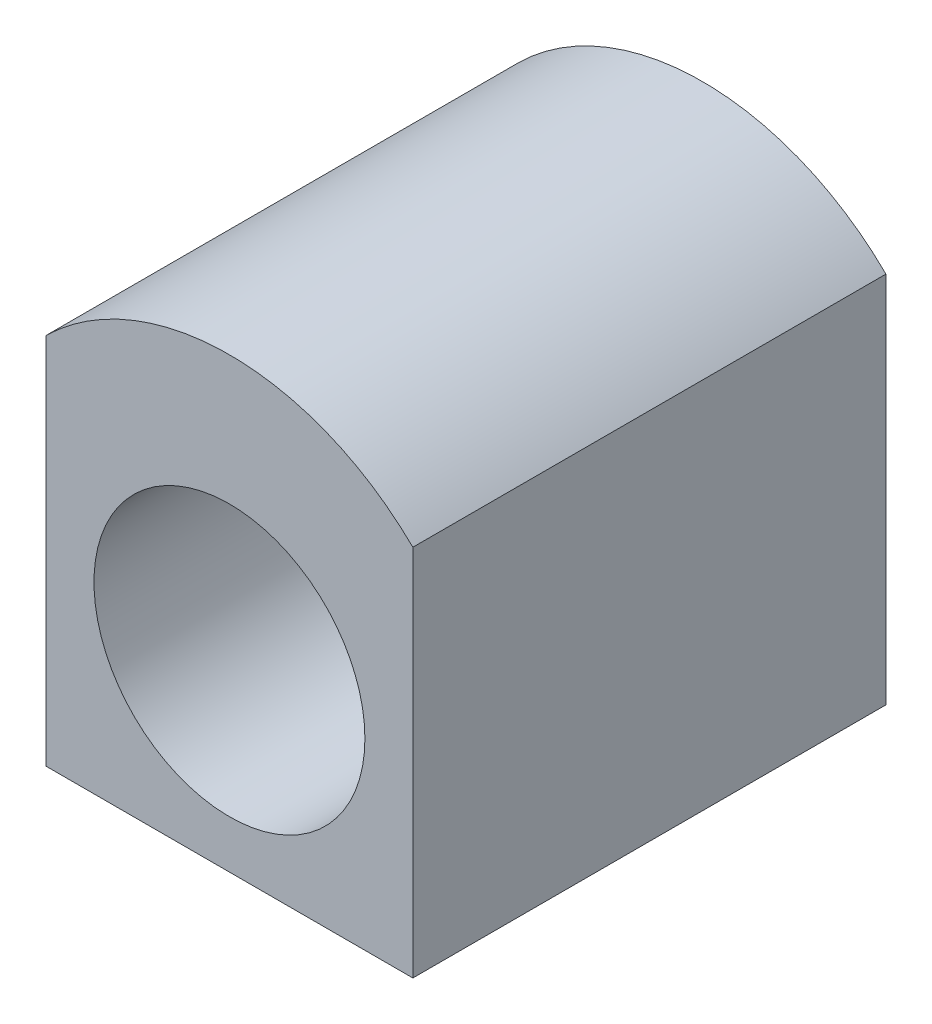
ISO-10303-21;
HEADER;
FILE_DESCRIPTION(('STEP AP214'),'2;1');
FILE_NAME('part.step','',(''),(''),'','','');
FILE_SCHEMA(('AUTOMOTIVE_DESIGN { 1 0 10303 214 1 1 1 1 }'));
ENDSEC;
DATA;
#1=APPLICATION_CONTEXT('core data for automotive mechanical design processes');
#2=APPLICATION_PROTOCOL_DEFINITION('international standard','automotive_design',2000,#1);
#3=PRODUCT_CONTEXT('',#1,'mechanical');
#4=PRODUCT('Part','Part','',(#3));
#5=PRODUCT_RELATED_PRODUCT_CATEGORY('part','',(#4));
#6=PRODUCT_DEFINITION_FORMATION('','',#4);
#7=PRODUCT_DEFINITION_CONTEXT('part definition',#1,'design');
#8=PRODUCT_DEFINITION('design','',#6,#7);
#9=PRODUCT_DEFINITION_SHAPE('','',#8);
#10=(LENGTH_UNIT() NAMED_UNIT(*) SI_UNIT(.MILLI.,.METRE.));
#11=(NAMED_UNIT(*) PLANE_ANGLE_UNIT() SI_UNIT($,.RADIAN.));
#12=(NAMED_UNIT(*) SI_UNIT($,.STERADIAN.) SOLID_ANGLE_UNIT());
#13=UNCERTAINTY_MEASURE_WITH_UNIT(LENGTH_MEASURE(1.E-05),#10,'distance_accuracy_value','');
#14=(GEOMETRIC_REPRESENTATION_CONTEXT(3) GLOBAL_UNCERTAINTY_ASSIGNED_CONTEXT((#13)) GLOBAL_UNIT_ASSIGNED_CONTEXT((#10,
#11,#12)) REPRESENTATION_CONTEXT('',''));
#15=CARTESIAN_POINT('',(0.,0.,0.));
#16=DIRECTION('',(0.,0.,1.));
#17=DIRECTION('',(1.,0.,0.));
#18=AXIS2_PLACEMENT_3D('',#15,#16,#17);
#19=CARTESIAN_POINT('',(-8.8,0.,22.7));
#20=DIRECTION('',(1.,0.,0.));
#21=DIRECTION('',(0.,0.,-1.));
#22=AXIS2_PLACEMENT_3D('',#19,#20,#21);
#23=PLANE('',#22);
#24=DIRECTION('',(0.,-1.,0.));
#25=VECTOR('',#24,1.);
#26=CARTESIAN_POINT('',(-8.8,0.,0.));
#27=LINE('',#26,#25);
#28=CARTESIAN_POINT('',(-8.8,17.9,0.));
#29=VERTEX_POINT('',#28);
#30=CARTESIAN_POINT('',(-8.8,0.,0.));
#31=VERTEX_POINT('',#30);
#32=EDGE_CURVE('E97',#29,#31,#27,.T.);
#33=ORIENTED_EDGE('',*,*,#32,.T.);
#34=DIRECTION('',(0.,0.,-1.));
#35=VECTOR('',#34,1.);
#36=CARTESIAN_POINT('',(-8.8,0.,22.7));
#37=LINE('',#36,#35);
#38=CARTESIAN_POINT('',(-8.8,0.,22.7));
#39=VERTEX_POINT('',#38);
#40=EDGE_CURVE('E11',#39,#31,#37,.T.);
#41=ORIENTED_EDGE('',*,*,#40,.F.);
#42=DIRECTION('',(0.,-1.,0.));
#43=VECTOR('',#42,1.);
#44=CARTESIAN_POINT('',(-8.8,0.,22.7));
#45=LINE('',#44,#43);
#46=CARTESIAN_POINT('',(-8.8,17.9,22.7));
#47=VERTEX_POINT('',#46);
#48=EDGE_CURVE('E85',#47,#39,#45,.T.);
#49=ORIENTED_EDGE('',*,*,#48,.F.);
#50=DIRECTION('',(0.,0.,-1.));
#51=VECTOR('',#50,1.);
#52=CARTESIAN_POINT('',(-8.8,17.9,22.7));
#53=LINE('',#52,#51);
#54=EDGE_CURVE('E93',#47,#29,#53,.T.);
#55=ORIENTED_EDGE('',*,*,#54,.T.);
#56=EDGE_LOOP('',(#33,#41,#49,#55));
#57=FACE_BOUND('',#56,.T.);
#58=ADVANCED_FACE('F34',(#57),#23,.F.);
#59=CARTESIAN_POINT('',(-8.8,0.,22.7));
#60=DIRECTION('',(0.,1.,0.));
#61=DIRECTION('',(0.,0.,1.));
#62=AXIS2_PLACEMENT_3D('',#59,#60,#61);
#63=PLANE('',#62);
#64=DIRECTION('',(1.,0.,0.));
#65=VECTOR('',#64,1.);
#66=CARTESIAN_POINT('',(-8.8,0.,0.));
#67=LINE('',#66,#65);
#68=CARTESIAN_POINT('',(8.8,0.,0.));
#69=VERTEX_POINT('',#68);
#70=EDGE_CURVE('E89',#31,#69,#67,.T.);
#71=ORIENTED_EDGE('',*,*,#70,.T.);
#72=DIRECTION('',(0.,0.,-1.));
#73=VECTOR('',#72,1.);
#74=CARTESIAN_POINT('',(8.8,0.,22.7));
#75=LINE('',#74,#73);
#76=CARTESIAN_POINT('',(8.8,0.,22.7));
#77=VERTEX_POINT('',#76);
#78=EDGE_CURVE('E42',#77,#69,#75,.T.);
#79=ORIENTED_EDGE('',*,*,#78,.F.);
#80=DIRECTION('',(1.,0.,0.));
#81=VECTOR('',#80,1.);
#82=CARTESIAN_POINT('',(-8.8,0.,22.7));
#83=LINE('',#82,#81);
#84=EDGE_CURVE('E80',#39,#77,#83,.T.);
#85=ORIENTED_EDGE('',*,*,#84,.F.);
#86=ORIENTED_EDGE('',*,*,#40,.T.);
#87=EDGE_LOOP('',(#71,#79,#85,#86));
#88=FACE_BOUND('',#87,.T.);
#89=ADVANCED_FACE('F88',(#88),#63,.F.);
#90=CARTESIAN_POINT('',(8.8,0.,22.7));
#91=DIRECTION('',(-1.,0.,0.));
#92=DIRECTION('',(0.,0.,1.));
#93=AXIS2_PLACEMENT_3D('',#90,#91,#92);
#94=PLANE('',#93);
#95=DIRECTION('',(0.,1.,0.));
#96=VECTOR('',#95,1.);
#97=CARTESIAN_POINT('',(8.8,0.,0.));
#98=LINE('',#97,#96);
#99=CARTESIAN_POINT('',(8.8,17.9,0.));
#100=VERTEX_POINT('',#99);
#101=EDGE_CURVE('E67',#69,#100,#98,.T.);
#102=ORIENTED_EDGE('',*,*,#101,.T.);
#103=DIRECTION('',(0.,0.,-1.));
#104=VECTOR('',#103,1.);
#105=CARTESIAN_POINT('',(8.8,17.9,22.7));
#106=LINE('',#105,#104);
#107=CARTESIAN_POINT('',(8.8,17.9,22.7));
#108=VERTEX_POINT('',#107);
#109=EDGE_CURVE('E90',#108,#100,#106,.T.);
#110=ORIENTED_EDGE('',*,*,#109,.F.);
#111=DIRECTION('',(0.,1.,0.));
#112=VECTOR('',#111,1.);
#113=CARTESIAN_POINT('',(8.8,0.,22.7));
#114=LINE('',#113,#112);
#115=EDGE_CURVE('E83',#77,#108,#114,.T.);
#116=ORIENTED_EDGE('',*,*,#115,.F.);
#117=ORIENTED_EDGE('',*,*,#78,.T.);
#118=EDGE_LOOP('',(#102,#110,#116,#117));
#119=FACE_BOUND('',#118,.T.);
#120=ADVANCED_FACE('F91',(#119),#94,.F.);
#121=CARTESIAN_POINT('',(0.,8.94444444444444,22.7));
#122=DIRECTION('',(0.,0.,-1.));
#123=DIRECTION('',(-1.,0.,0.));
#124=AXIS2_PLACEMENT_3D('',#121,#122,#123);
#125=CYLINDRICAL_SURFACE('',#124,12.5555555555556);
#126=CARTESIAN_POINT('',(0.,8.94444444444444,0.));
#127=DIRECTION('',(0.,0.,1.));
#128=DIRECTION('',(-1.,0.,0.));
#129=AXIS2_PLACEMENT_3D('',#126,#127,#128);
#130=CIRCLE('',#129,12.5555555555556);
#131=EDGE_CURVE('E73',#100,#29,#130,.T.);
#132=ORIENTED_EDGE('',*,*,#131,.T.);
#133=ORIENTED_EDGE('',*,*,#54,.F.);
#134=CARTESIAN_POINT('',(0.,8.94444444444444,22.7));
#135=DIRECTION('',(0.,0.,1.));
#136=DIRECTION('',(-1.,0.,0.));
#137=AXIS2_PLACEMENT_3D('',#134,#135,#136);
#138=CIRCLE('',#137,12.5555555555556);
#139=EDGE_CURVE('E50',#108,#47,#138,.T.);
#140=ORIENTED_EDGE('',*,*,#139,.F.);
#141=ORIENTED_EDGE('',*,*,#109,.T.);
#142=EDGE_LOOP('',(#132,#133,#140,#141));
#143=FACE_BOUND('',#142,.T.);
#144=ADVANCED_FACE('F105',(#143),#125,.T.);
#145=CARTESIAN_POINT('',(0.,8.94444444444444,22.7));
#146=DIRECTION('',(0.,0.,-1.));
#147=DIRECTION('',(-1.,0.,0.));
#148=AXIS2_PLACEMENT_3D('',#145,#146,#147);
#149=PLANE('',#148);
#150=CARTESIAN_POINT('',(0.,8.8,22.7));
#151=DIRECTION('',(0.,0.,1.));
#152=DIRECTION('',(1.,0.,0.));
#153=AXIS2_PLACEMENT_3D('',#150,#151,#152);
#154=CIRCLE('',#153,6.5);
#155=CARTESIAN_POINT('',(6.5,8.8,22.7));
#156=VERTEX_POINT('',#155);
#157=EDGE_CURVE('E111',#156,#156,#154,.T.);
#158=ORIENTED_EDGE('',*,*,#157,.F.);
#159=EDGE_LOOP('',(#158));
#160=FACE_BOUND('',#159,.T.);
#161=ORIENTED_EDGE('',*,*,#48,.T.);
#162=ORIENTED_EDGE('',*,*,#84,.T.);
#163=ORIENTED_EDGE('',*,*,#115,.T.);
#164=ORIENTED_EDGE('',*,*,#139,.T.);
#165=EDGE_LOOP('',(#161,#162,#163,#164));
#166=FACE_BOUND('',#165,.T.);
#167=ADVANCED_FACE('F81',(#160,#166),#149,.F.);
#168=CARTESIAN_POINT('',(0.,8.94444444444444,0.));
#169=DIRECTION('',(0.,0.,-1.));
#170=DIRECTION('',(-1.,0.,0.));
#171=AXIS2_PLACEMENT_3D('',#168,#169,#170);
#172=PLANE('',#171);
#173=CARTESIAN_POINT('',(0.,8.8,0.));
#174=DIRECTION('',(0.,0.,1.));
#175=DIRECTION('',(1.,0.,0.));
#176=AXIS2_PLACEMENT_3D('',#173,#174,#175);
#177=CIRCLE('',#176,6.5);
#178=CARTESIAN_POINT('',(6.5,8.8,0.));
#179=VERTEX_POINT('',#178);
#180=EDGE_CURVE('E100',#179,#179,#177,.T.);
#181=ORIENTED_EDGE('',*,*,#180,.T.);
#182=EDGE_LOOP('',(#181));
#183=FACE_BOUND('',#182,.T.);
#184=ORIENTED_EDGE('',*,*,#32,.F.);
#185=ORIENTED_EDGE('',*,*,#131,.F.);
#186=ORIENTED_EDGE('',*,*,#101,.F.);
#187=ORIENTED_EDGE('',*,*,#70,.F.);
#188=EDGE_LOOP('',(#184,#185,#186,#187));
#189=FACE_BOUND('',#188,.T.);
#190=ADVANCED_FACE('F108',(#183,#189),#172,.T.);
#191=CARTESIAN_POINT('',(0.,8.8,0.));
#192=DIRECTION('',(0.,0.,1.));
#193=DIRECTION('',(1.,0.,0.));
#194=AXIS2_PLACEMENT_3D('',#191,#192,#193);
#195=CYLINDRICAL_SURFACE('',#194,6.5);
#196=ORIENTED_EDGE('',*,*,#180,.F.);
#197=EDGE_LOOP('',(#196));
#198=FACE_BOUND('',#197,.T.);
#199=ORIENTED_EDGE('',*,*,#157,.T.);
#200=EDGE_LOOP('',(#199));
#201=FACE_BOUND('',#200,.T.);
#202=ADVANCED_FACE('F118',(#198,#201),#195,.F.);
#203=CLOSED_SHELL('',(#58,#89,#120,#144,#167,#190,#202));
#204=MANIFOLD_SOLID_BREP('B2',#203);
#205=ADVANCED_BREP_SHAPE_REPRESENTATION('',(#18,#204),#14);
#206=SHAPE_DEFINITION_REPRESENTATION(#9,#205);
ENDSEC;
END-ISO-10303-21;
